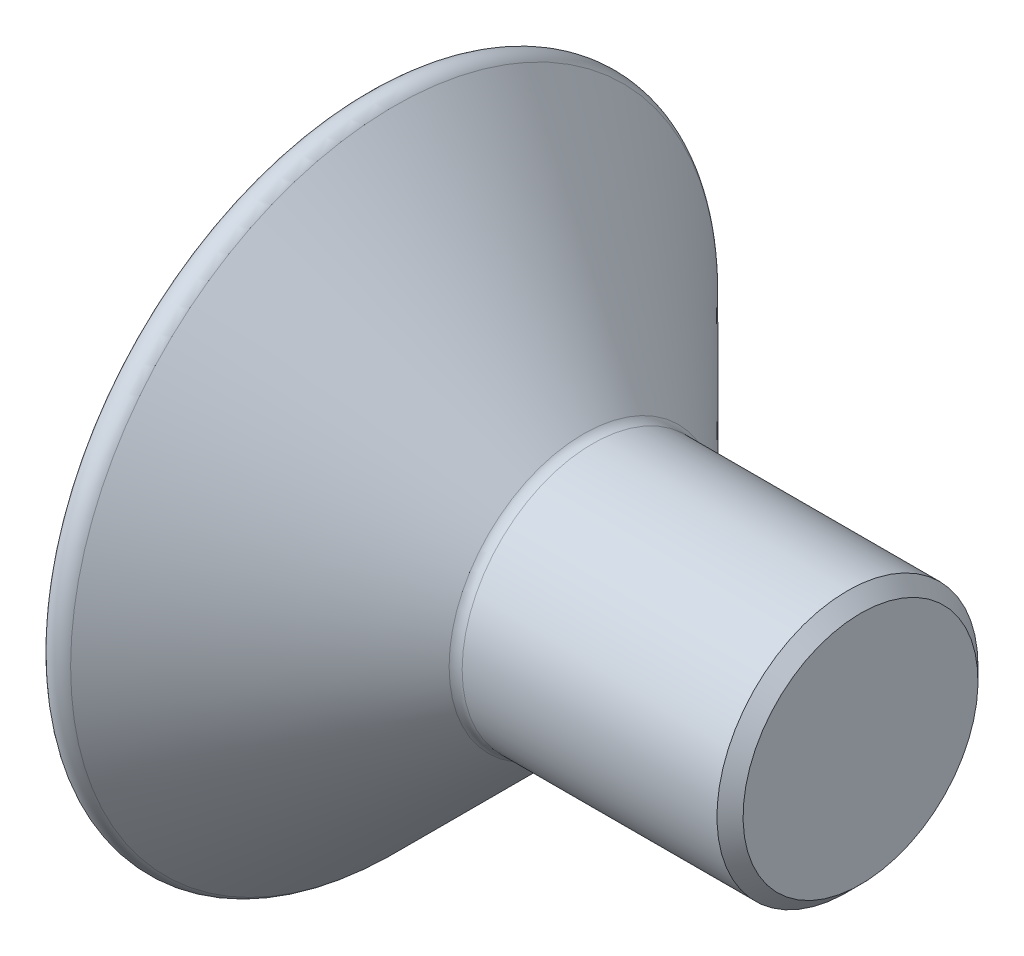
ISO-10303-21;
HEADER;
FILE_DESCRIPTION(('STEP AP214'),'2;1');
FILE_NAME('part.step','',(''),(''),'','','');
FILE_SCHEMA(('AUTOMOTIVE_DESIGN { 1 0 10303 214 1 1 1 1 }'));
ENDSEC;
DATA;
#1=APPLICATION_CONTEXT('core data for automotive mechanical design processes');
#2=APPLICATION_PROTOCOL_DEFINITION('international standard','automotive_design',2000,#1);
#3=PRODUCT_CONTEXT('',#1,'mechanical');
#4=PRODUCT('Part','Part','',(#3));
#5=PRODUCT_RELATED_PRODUCT_CATEGORY('part','',(#4));
#6=PRODUCT_DEFINITION_FORMATION('','',#4);
#7=PRODUCT_DEFINITION_CONTEXT('part definition',#1,'design');
#8=PRODUCT_DEFINITION('design','',#6,#7);
#9=PRODUCT_DEFINITION_SHAPE('','',#8);
#10=(LENGTH_UNIT() NAMED_UNIT(*) SI_UNIT(.MILLI.,.METRE.));
#11=(NAMED_UNIT(*) PLANE_ANGLE_UNIT() SI_UNIT($,.RADIAN.));
#12=(NAMED_UNIT(*) SI_UNIT($,.STERADIAN.) SOLID_ANGLE_UNIT());
#13=UNCERTAINTY_MEASURE_WITH_UNIT(LENGTH_MEASURE(1.E-05),#10,'distance_accuracy_value','');
#14=(GEOMETRIC_REPRESENTATION_CONTEXT(3) GLOBAL_UNCERTAINTY_ASSIGNED_CONTEXT((#13)) GLOBAL_UNIT_ASSIGNED_CONTEXT((#10,
#11,#12)) REPRESENTATION_CONTEXT('',''));
#15=CARTESIAN_POINT('',(0.,0.,0.));
#16=DIRECTION('',(0.,0.,1.));
#17=DIRECTION('',(1.,0.,0.));
#18=AXIS2_PLACEMENT_3D('',#15,#16,#17);
#19=CARTESIAN_POINT('',(-0.587069180985524,0.,0.));
#20=DIRECTION('',(-1.,0.,0.));
#21=DIRECTION('',(0.,0.,1.));
#22=AXIS2_PLACEMENT_3D('',#19,#20,#21);
#23=CYLINDRICAL_SURFACE('',#22,1.5);
#24=CARTESIAN_POINT('',(5.34999999999997,0.,0.));
#25=DIRECTION('',(1.,0.,0.));
#26=DIRECTION('',(0.,0.,-1.));
#27=AXIS2_PLACEMENT_3D('',#24,#25,#26);
#28=CIRCLE('',#27,1.5);
#29=CARTESIAN_POINT('',(5.34999999999997,0.,-1.5));
#30=VERTEX_POINT('',#29);
#31=EDGE_CURVE('E11',#30,#30,#28,.F.);
#32=ORIENTED_EDGE('',*,*,#31,.T.);
#33=EDGE_LOOP('',(#32));
#34=FACE_BOUND('',#33,.T.);
#35=CARTESIAN_POINT('',(2.42213203435594,0.,0.));
#36=DIRECTION('',(1.,0.,0.));
#37=DIRECTION('',(0.,0.,-1.));
#38=AXIS2_PLACEMENT_3D('',#35,#36,#37);
#39=CIRCLE('',#38,1.5);
#40=CARTESIAN_POINT('',(2.42213203435594,0.,-1.5));
#41=VERTEX_POINT('',#40);
#42=EDGE_CURVE('E192',#41,#41,#39,.T.);
#43=ORIENTED_EDGE('',*,*,#42,.T.);
#44=EDGE_LOOP('',(#43));
#45=FACE_BOUND('',#44,.T.);
#46=ADVANCED_FACE('F41',(#34,#45),#23,.T.);
#47=CARTESIAN_POINT('',(0.5,0.,0.));
#48=DIRECTION('',(-1.,0.,0.));
#49=DIRECTION('',(0.,0.,1.));
#50=AXIS2_PLACEMENT_3D('',#47,#48,#49);
#51=CONICAL_SURFACE('',#50,3.36,0.785398163397454);
#52=CARTESIAN_POINT('',(2.31606601717796,0.,0.));
#53=DIRECTION('',(1.,0.,0.));
#54=DIRECTION('',(0.,0.,-1.));
#55=AXIS2_PLACEMENT_3D('',#52,#53,#54);
#56=CIRCLE('',#55,1.54393398282202);
#57=CARTESIAN_POINT('',(2.31606601717796,0.,-1.54393398282202));
#58=VERTEX_POINT('',#57);
#59=EDGE_CURVE('E195',#58,#58,#56,.F.);
#60=ORIENTED_EDGE('',*,*,#59,.T.);
#61=EDGE_LOOP('',(#60));
#62=FACE_BOUND('',#61,.T.);
#63=CARTESIAN_POINT('',(0.141421356237312,0.,0.));
#64=DIRECTION('',(-1.,0.,0.));
#65=DIRECTION('',(0.,0.,1.));
#66=AXIS2_PLACEMENT_3D('',#63,#64,#65);
#67=CIRCLE('',#66,3.71857864376269);
#68=CARTESIAN_POINT('',(0.141421356237312,0.,3.71857864376269));
#69=VERTEX_POINT('',#68);
#70=EDGE_CURVE('E186',#69,#69,#67,.F.);
#71=ORIENTED_EDGE('',*,*,#70,.T.);
#72=EDGE_LOOP('',(#71));
#73=FACE_BOUND('',#72,.T.);
#74=ADVANCED_FACE('F211',(#62,#73),#51,.T.);
#75=CARTESIAN_POINT('',(-0.150000000000001,0.,0.));
#76=DIRECTION('',(1.,0.,0.));
#77=DIRECTION('',(0.,0.,-1.));
#78=AXIS2_PLACEMENT_3D('',#75,#76,#77);
#79=CONICAL_SURFACE('',#78,3.71,0.785398163397451);
#80=CARTESIAN_POINT('',(-0.141421356237308,0.,0.));
#81=DIRECTION('',(1.,0.,0.));
#82=DIRECTION('',(0.,0.,-1.));
#83=AXIS2_PLACEMENT_3D('',#80,#81,#82);
#84=CIRCLE('',#83,3.71857864376269);
#85=CARTESIAN_POINT('',(-0.141421356237308,0.,-3.71857864376269));
#86=VERTEX_POINT('',#85);
#87=EDGE_CURVE('E189',#86,#86,#84,.F.);
#88=ORIENTED_EDGE('',*,*,#87,.T.);
#89=EDGE_LOOP('',(#88));
#90=FACE_BOUND('',#89,.T.);
#91=CARTESIAN_POINT('',(-0.150000000000001,0.,0.));
#92=DIRECTION('',(1.,0.,0.));
#93=DIRECTION('',(0.,0.,-1.));
#94=AXIS2_PLACEMENT_3D('',#91,#92,#93);
#95=CIRCLE('',#94,3.71);
#96=CARTESIAN_POINT('',(-0.150000000000001,0.,-3.71));
#97=VERTEX_POINT('',#96);
#98=EDGE_CURVE('E142',#97,#97,#95,.T.);
#99=ORIENTED_EDGE('',*,*,#98,.T.);
#100=EDGE_LOOP('',(#99));
#101=FACE_BOUND('',#100,.T.);
#102=ADVANCED_FACE('F217',(#90,#101),#79,.T.);
#103=CARTESIAN_POINT('',(1.67735026918963,0.,0.));
#104=DIRECTION('',(-1.,0.,0.));
#105=DIRECTION('',(0.,0.,1.));
#106=AXIS2_PLACEMENT_3D('',#103,#104,#105);
#107=CONICAL_SURFACE('',#106,0.,1.0471975511966);
#108=CARTESIAN_POINT('',(1.1,0.,0.));
#109=DIRECTION('',(-1.,0.,0.));
#110=DIRECTION('',(0.,0.,1.));
#111=AXIS2_PLACEMENT_3D('',#108,#109,#110);
#112=CIRCLE('',#111,1.);
#113=CARTESIAN_POINT('',(1.1,0.5,0.866025403784438));
#114=VERTEX_POINT('',#113);
#115=CARTESIAN_POINT('',(1.1,1.,0.));
#116=VERTEX_POINT('',#115);
#117=EDGE_CURVE('E154',#114,#116,#112,.T.);
#118=ORIENTED_EDGE('',*,*,#117,.T.);
#119=CARTESIAN_POINT('',(1.1,0.5,-0.866025403784439));
#120=VERTEX_POINT('',#119);
#121=EDGE_CURVE('E157',#116,#120,#112,.T.);
#122=ORIENTED_EDGE('',*,*,#121,.T.);
#123=CARTESIAN_POINT('',(1.1,-0.5,-0.866025403784439));
#124=VERTEX_POINT('',#123);
#125=EDGE_CURVE('E300',#120,#124,#112,.T.);
#126=ORIENTED_EDGE('',*,*,#125,.T.);
#127=CARTESIAN_POINT('',(1.1,-1.,0.));
#128=VERTEX_POINT('',#127);
#129=EDGE_CURVE('E291',#124,#128,#112,.T.);
#130=ORIENTED_EDGE('',*,*,#129,.T.);
#131=CARTESIAN_POINT('',(1.1,-0.5,0.866025403784438));
#132=VERTEX_POINT('',#131);
#133=EDGE_CURVE('E56',#128,#132,#112,.T.);
#134=ORIENTED_EDGE('',*,*,#133,.T.);
#135=EDGE_CURVE('E158',#132,#114,#112,.T.);
#136=ORIENTED_EDGE('',*,*,#135,.T.);
#137=EDGE_LOOP('',(#118,#122,#126,#130,#134,#136));
#138=FACE_BOUND('',#137,.T.);
#139=CARTESIAN_POINT('',(1.67735026918963,0.,0.));
#140=VERTEX_POINT('',#139);
#141=VERTEX_LOOP('',#140);
#142=FACE_BOUND('',#141,.T.);
#143=ADVANCED_FACE('F240',(#138,#142),#107,.F.);
#144=CARTESIAN_POINT('',(1.1,0.,-1.15470053837925));
#145=DIRECTION('',(1.,0.,0.));
#146=DIRECTION('',(0.,0.,-1.));
#147=AXIS2_PLACEMENT_3D('',#144,#145,#146);
#148=PLANE('',#147);
#149=ORIENTED_EDGE('',*,*,#135,.F.);
#150=DIRECTION('',(0.,-0.866025403784438,-0.5));
#151=VECTOR('',#150,1.);
#152=CARTESIAN_POINT('',(1.1,0.,1.15470053837925));
#153=LINE('',#152,#151);
#154=CARTESIAN_POINT('',(1.1,0.,1.15470053837925));
#155=VERTEX_POINT('',#154);
#156=EDGE_CURVE('E174',#155,#132,#153,.T.);
#157=ORIENTED_EDGE('',*,*,#156,.F.);
#158=DIRECTION('',(0.,-0.866025403784439,0.5));
#159=VECTOR('',#158,1.);
#160=CARTESIAN_POINT('',(1.1,1.,0.577350269189625));
#161=LINE('',#160,#159);
#162=EDGE_CURVE('E169',#114,#155,#161,.T.);
#163=ORIENTED_EDGE('',*,*,#162,.F.);
#164=EDGE_LOOP('',(#149,#157,#163));
#165=FACE_BOUND('',#164,.T.);
#166=ADVANCED_FACE('F246',(#165),#148,.F.);
#167=ORIENTED_EDGE('',*,*,#117,.F.);
#168=CARTESIAN_POINT('',(1.1,1.,0.577350269189625));
#169=VERTEX_POINT('',#168);
#170=EDGE_CURVE('E170',#169,#114,#161,.T.);
#171=ORIENTED_EDGE('',*,*,#170,.F.);
#172=DIRECTION('',(0.,0.,1.));
#173=VECTOR('',#172,1.);
#174=CARTESIAN_POINT('',(1.1,1.,-0.577350269189626));
#175=LINE('',#174,#173);
#176=EDGE_CURVE('E165',#116,#169,#175,.T.);
#177=ORIENTED_EDGE('',*,*,#176,.F.);
#178=EDGE_LOOP('',(#167,#171,#177));
#179=FACE_BOUND('',#178,.T.);
#180=ADVANCED_FACE('F249',(#179),#148,.F.);
#181=ORIENTED_EDGE('',*,*,#121,.F.);
#182=CARTESIAN_POINT('',(1.1,1.,-0.577350269189626));
#183=VERTEX_POINT('',#182);
#184=EDGE_CURVE('E166',#183,#116,#175,.T.);
#185=ORIENTED_EDGE('',*,*,#184,.F.);
#186=DIRECTION('',(0.,0.866025403784438,0.5));
#187=VECTOR('',#186,1.);
#188=CARTESIAN_POINT('',(1.1,0.,-1.15470053837925));
#189=LINE('',#188,#187);
#190=EDGE_CURVE('E161',#120,#183,#189,.T.);
#191=ORIENTED_EDGE('',*,*,#190,.F.);
#192=EDGE_LOOP('',(#181,#185,#191));
#193=FACE_BOUND('',#192,.T.);
#194=ADVANCED_FACE('F252',(#193),#148,.F.);
#195=ORIENTED_EDGE('',*,*,#125,.F.);
#196=CARTESIAN_POINT('',(1.1,0.,-1.15470053837925));
#197=VERTEX_POINT('',#196);
#198=EDGE_CURVE('E162',#197,#120,#189,.T.);
#199=ORIENTED_EDGE('',*,*,#198,.F.);
#200=DIRECTION('',(0.,0.866025403784439,-0.5));
#201=VECTOR('',#200,1.);
#202=CARTESIAN_POINT('',(1.1,-1.,-0.577350269189627));
#203=LINE('',#202,#201);
#204=EDGE_CURVE('E156',#124,#197,#203,.T.);
#205=ORIENTED_EDGE('',*,*,#204,.F.);
#206=EDGE_LOOP('',(#195,#199,#205));
#207=FACE_BOUND('',#206,.T.);
#208=ADVANCED_FACE('F299',(#207),#148,.F.);
#209=ORIENTED_EDGE('',*,*,#129,.F.);
#210=CARTESIAN_POINT('',(1.1,-1.,-0.577350269189627));
#211=VERTEX_POINT('',#210);
#212=EDGE_CURVE('E159',#211,#124,#203,.T.);
#213=ORIENTED_EDGE('',*,*,#212,.F.);
#214=DIRECTION('',(0.,0.,-1.));
#215=VECTOR('',#214,1.);
#216=CARTESIAN_POINT('',(1.1,-1.,0.577350269189625));
#217=LINE('',#216,#215);
#218=EDGE_CURVE('E64',#128,#211,#217,.T.);
#219=ORIENTED_EDGE('',*,*,#218,.F.);
#220=EDGE_LOOP('',(#209,#213,#219));
#221=FACE_BOUND('',#220,.T.);
#222=ADVANCED_FACE('F294',(#221),#148,.F.);
#223=ORIENTED_EDGE('',*,*,#133,.F.);
#224=CARTESIAN_POINT('',(1.1,-1.,0.577350269189625));
#225=VERTEX_POINT('',#224);
#226=EDGE_CURVE('E124',#225,#128,#217,.T.);
#227=ORIENTED_EDGE('',*,*,#226,.F.);
#228=EDGE_CURVE('E173',#132,#225,#153,.T.);
#229=ORIENTED_EDGE('',*,*,#228,.F.);
#230=EDGE_LOOP('',(#223,#227,#229));
#231=FACE_BOUND('',#230,.T.);
#232=ADVANCED_FACE('F260',(#231),#148,.F.);
#233=CARTESIAN_POINT('',(1.1,0.,1.15470053837925));
#234=DIRECTION('',(0.,0.5,-0.866025403784438));
#235=DIRECTION('',(0.,0.866025403784438,0.5));
#236=AXIS2_PLACEMENT_3D('',#233,#234,#235);
#237=PLANE('',#236);
#238=DIRECTION('',(-1.,0.,0.));
#239=VECTOR('',#238,1.);
#240=CARTESIAN_POINT('',(1.1,-1.,0.577350269189625));
#241=LINE('',#240,#239);
#242=CARTESIAN_POINT('',(-0.15,-1.,0.577350269189625));
#243=VERTEX_POINT('',#242);
#244=EDGE_CURVE('E123',#225,#243,#241,.T.);
#245=ORIENTED_EDGE('',*,*,#244,.T.);
#246=DIRECTION('',(0.,-0.866025403784438,-0.5));
#247=VECTOR('',#246,1.);
#248=CARTESIAN_POINT('',(-0.15,-0.5,0.866025403784438));
#249=LINE('',#248,#247);
#250=CARTESIAN_POINT('',(-0.15,0.,1.15470053837925));
#251=VERTEX_POINT('',#250);
#252=EDGE_CURVE('E141',#251,#243,#249,.T.);
#253=ORIENTED_EDGE('',*,*,#252,.F.);
#254=DIRECTION('',(-1.,0.,0.));
#255=VECTOR('',#254,1.);
#256=CARTESIAN_POINT('',(1.1,0.,1.15470053837925));
#257=LINE('',#256,#255);
#258=EDGE_CURVE('E179',#155,#251,#257,.T.);
#259=ORIENTED_EDGE('',*,*,#258,.F.);
#260=ORIENTED_EDGE('',*,*,#156,.T.);
#261=ORIENTED_EDGE('',*,*,#228,.T.);
#262=EDGE_LOOP('',(#245,#253,#259,#260,#261));
#263=FACE_BOUND('',#262,.T.);
#264=ADVANCED_FACE('F256',(#263),#237,.T.);
#265=CARTESIAN_POINT('',(1.1,1.,0.577350269189625));
#266=DIRECTION('',(0.,-0.5,-0.866025403784438));
#267=DIRECTION('',(0.,0.866025403784439,-0.5));
#268=AXIS2_PLACEMENT_3D('',#265,#266,#267);
#269=PLANE('',#268);
#270=ORIENTED_EDGE('',*,*,#258,.T.);
#271=DIRECTION('',(0.,-0.866025403784439,0.5));
#272=VECTOR('',#271,1.);
#273=CARTESIAN_POINT('',(-0.15,0.5,0.866025403784438));
#274=LINE('',#273,#272);
#275=CARTESIAN_POINT('',(-0.15,1.,0.577350269189625));
#276=VERTEX_POINT('',#275);
#277=EDGE_CURVE('E151',#276,#251,#274,.T.);
#278=ORIENTED_EDGE('',*,*,#277,.F.);
#279=DIRECTION('',(-1.,0.,0.));
#280=VECTOR('',#279,1.);
#281=CARTESIAN_POINT('',(1.1,1.,0.577350269189625));
#282=LINE('',#281,#280);
#283=EDGE_CURVE('E181',#169,#276,#282,.T.);
#284=ORIENTED_EDGE('',*,*,#283,.F.);
#285=ORIENTED_EDGE('',*,*,#170,.T.);
#286=ORIENTED_EDGE('',*,*,#162,.T.);
#287=EDGE_LOOP('',(#270,#278,#284,#285,#286));
#288=FACE_BOUND('',#287,.T.);
#289=ADVANCED_FACE('F259',(#288),#269,.T.);
#290=CARTESIAN_POINT('',(1.1,1.,-0.577350269189626));
#291=DIRECTION('',(0.,-1.,0.));
#292=DIRECTION('',(0.,0.,-1.));
#293=AXIS2_PLACEMENT_3D('',#290,#291,#292);
#294=PLANE('',#293);
#295=ORIENTED_EDGE('',*,*,#283,.T.);
#296=DIRECTION('',(0.,0.,1.));
#297=VECTOR('',#296,1.);
#298=CARTESIAN_POINT('',(-0.15,1.,0.));
#299=LINE('',#298,#297);
#300=CARTESIAN_POINT('',(-0.15,1.,-0.577350269189626));
#301=VERTEX_POINT('',#300);
#302=EDGE_CURVE('E148',#301,#276,#299,.T.);
#303=ORIENTED_EDGE('',*,*,#302,.F.);
#304=DIRECTION('',(-1.,0.,0.));
#305=VECTOR('',#304,1.);
#306=CARTESIAN_POINT('',(1.1,1.,-0.577350269189626));
#307=LINE('',#306,#305);
#308=EDGE_CURVE('E183',#183,#301,#307,.T.);
#309=ORIENTED_EDGE('',*,*,#308,.F.);
#310=ORIENTED_EDGE('',*,*,#184,.T.);
#311=ORIENTED_EDGE('',*,*,#176,.T.);
#312=EDGE_LOOP('',(#295,#303,#309,#310,#311));
#313=FACE_BOUND('',#312,.T.);
#314=ADVANCED_FACE('F264',(#313),#294,.T.);
#315=CARTESIAN_POINT('',(1.1,0.,-1.15470053837925));
#316=DIRECTION('',(0.,-0.5,0.866025403784439));
#317=DIRECTION('',(0.,-0.866025403784439,-0.5));
#318=AXIS2_PLACEMENT_3D('',#315,#316,#317);
#319=PLANE('',#318);
#320=ORIENTED_EDGE('',*,*,#308,.T.);
#321=DIRECTION('',(0.,0.866025403784438,0.5));
#322=VECTOR('',#321,1.);
#323=CARTESIAN_POINT('',(-0.15,0.5,-0.866025403784438));
#324=LINE('',#323,#322);
#325=CARTESIAN_POINT('',(-0.15,0.,-1.15470053837925));
#326=VERTEX_POINT('',#325);
#327=EDGE_CURVE('E134',#326,#301,#324,.T.);
#328=ORIENTED_EDGE('',*,*,#327,.F.);
#329=DIRECTION('',(-1.,0.,0.));
#330=VECTOR('',#329,1.);
#331=CARTESIAN_POINT('',(1.1,0.,-1.15470053837925));
#332=LINE('',#331,#330);
#333=EDGE_CURVE('E130',#197,#326,#332,.T.);
#334=ORIENTED_EDGE('',*,*,#333,.F.);
#335=ORIENTED_EDGE('',*,*,#198,.T.);
#336=ORIENTED_EDGE('',*,*,#190,.T.);
#337=EDGE_LOOP('',(#320,#328,#334,#335,#336));
#338=FACE_BOUND('',#337,.T.);
#339=ADVANCED_FACE('F267',(#338),#319,.T.);
#340=CARTESIAN_POINT('',(1.1,-1.,-0.577350269189627));
#341=DIRECTION('',(0.,0.5,0.866025403784439));
#342=DIRECTION('',(0.,-0.866025403784439,0.5));
#343=AXIS2_PLACEMENT_3D('',#340,#341,#342);
#344=PLANE('',#343);
#345=ORIENTED_EDGE('',*,*,#333,.T.);
#346=DIRECTION('',(0.,0.866025403784439,-0.5));
#347=VECTOR('',#346,1.);
#348=CARTESIAN_POINT('',(-0.15,-0.500000000000001,-0.866025403784439));
#349=LINE('',#348,#347);
#350=CARTESIAN_POINT('',(-0.15,-1.,-0.577350269189627));
#351=VERTEX_POINT('',#350);
#352=EDGE_CURVE('E127',#351,#326,#349,.T.);
#353=ORIENTED_EDGE('',*,*,#352,.F.);
#354=DIRECTION('',(-1.,0.,0.));
#355=VECTOR('',#354,1.);
#356=CARTESIAN_POINT('',(1.1,-1.,-0.577350269189627));
#357=LINE('',#356,#355);
#358=EDGE_CURVE('E114',#211,#351,#357,.T.);
#359=ORIENTED_EDGE('',*,*,#358,.F.);
#360=ORIENTED_EDGE('',*,*,#212,.T.);
#361=ORIENTED_EDGE('',*,*,#204,.T.);
#362=EDGE_LOOP('',(#345,#353,#359,#360,#361));
#363=FACE_BOUND('',#362,.T.);
#364=ADVANCED_FACE('F128',(#363),#344,.T.);
#365=CARTESIAN_POINT('',(1.1,-1.,0.577350269189625));
#366=DIRECTION('',(0.,1.,0.));
#367=DIRECTION('',(0.,0.,1.));
#368=AXIS2_PLACEMENT_3D('',#365,#366,#367);
#369=PLANE('',#368);
#370=ORIENTED_EDGE('',*,*,#358,.T.);
#371=DIRECTION('',(0.,0.,-1.));
#372=VECTOR('',#371,1.);
#373=CARTESIAN_POINT('',(-0.15,-1.,0.));
#374=LINE('',#373,#372);
#375=EDGE_CURVE('E119',#243,#351,#374,.T.);
#376=ORIENTED_EDGE('',*,*,#375,.F.);
#377=ORIENTED_EDGE('',*,*,#244,.F.);
#378=ORIENTED_EDGE('',*,*,#226,.T.);
#379=ORIENTED_EDGE('',*,*,#218,.T.);
#380=EDGE_LOOP('',(#370,#376,#377,#378,#379));
#381=FACE_BOUND('',#380,.T.);
#382=ADVANCED_FACE('F116',(#381),#369,.T.);
#383=CARTESIAN_POINT('',(-0.15,0.,0.));
#384=DIRECTION('',(-1.,0.,0.));
#385=DIRECTION('',(0.,0.,1.));
#386=AXIS2_PLACEMENT_3D('',#383,#384,#385);
#387=PLANE('',#386);
#388=ORIENTED_EDGE('',*,*,#375,.T.);
#389=ORIENTED_EDGE('',*,*,#352,.T.);
#390=ORIENTED_EDGE('',*,*,#327,.T.);
#391=ORIENTED_EDGE('',*,*,#302,.T.);
#392=ORIENTED_EDGE('',*,*,#277,.T.);
#393=ORIENTED_EDGE('',*,*,#252,.T.);
#394=EDGE_LOOP('',(#388,#389,#390,#391,#392,#393));
#395=FACE_BOUND('',#394,.T.);
#396=ORIENTED_EDGE('',*,*,#98,.F.);
#397=EDGE_LOOP('',(#396));
#398=FACE_BOUND('',#397,.T.);
#399=ADVANCED_FACE('F137',(#395,#398),#387,.T.);
#400=CARTESIAN_POINT('',(0.,0.,0.));
#401=DIRECTION('',(-1.,0.,0.));
#402=DIRECTION('',(0.,0.,1.));
#403=AXIS2_PLACEMENT_3D('',#400,#401,#402);
#404=TOROIDAL_SURFACE('',#403,3.57715728752538,0.2);
#405=ORIENTED_EDGE('',*,*,#87,.F.);
#406=EDGE_LOOP('',(#405));
#407=FACE_BOUND('',#406,.T.);
#408=ORIENTED_EDGE('',*,*,#70,.F.);
#409=EDGE_LOOP('',(#408));
#410=FACE_BOUND('',#409,.T.);
#411=ADVANCED_FACE('F224',(#407,#410),#404,.T.);
#412=CARTESIAN_POINT('',(5.49999999999998,0.,0.));
#413=DIRECTION('',(1.,0.,0.));
#414=DIRECTION('',(0.,1.,0.));
#415=AXIS2_PLACEMENT_3D('',#412,#413,#414);
#416=PLANE('',#415);
#417=CARTESIAN_POINT('',(5.49999999999998,0.,0.));
#418=DIRECTION('',(1.,0.,0.));
#419=DIRECTION('',(0.,1.,0.));
#420=AXIS2_PLACEMENT_3D('',#417,#418,#419);
#421=CIRCLE('',#420,1.35);
#422=CARTESIAN_POINT('',(5.49999999999998,1.35,0.));
#423=VERTEX_POINT('',#422);
#424=EDGE_CURVE('E49',#423,#423,#421,.T.);
#425=ORIENTED_EDGE('',*,*,#424,.T.);
#426=EDGE_LOOP('',(#425));
#427=FACE_BOUND('',#426,.T.);
#428=ADVANCED_FACE('F200',(#427),#416,.T.);
#429=CARTESIAN_POINT('',(2.42213203435594,0.,0.));
#430=DIRECTION('',(1.,0.,0.));
#431=DIRECTION('',(0.,0.,-1.));
#432=AXIS2_PLACEMENT_3D('',#429,#430,#431);
#433=TOROIDAL_SURFACE('',#432,1.65,0.15);
#434=ORIENTED_EDGE('',*,*,#59,.F.);
#435=EDGE_LOOP('',(#434));
#436=FACE_BOUND('',#435,.T.);
#437=ORIENTED_EDGE('',*,*,#42,.F.);
#438=EDGE_LOOP('',(#437));
#439=FACE_BOUND('',#438,.T.);
#440=ADVANCED_FACE('F203',(#436,#439),#433,.F.);
#441=CARTESIAN_POINT('',(5.49999999999998,0.,0.));
#442=DIRECTION('',(-1.,0.,0.));
#443=DIRECTION('',(0.,0.,1.));
#444=AXIS2_PLACEMENT_3D('',#441,#442,#443);
#445=CONICAL_SURFACE('',#444,1.35,0.785398163397443);
#446=ORIENTED_EDGE('',*,*,#31,.F.);
#447=EDGE_LOOP('',(#446));
#448=FACE_BOUND('',#447,.T.);
#449=ORIENTED_EDGE('',*,*,#424,.F.);
#450=EDGE_LOOP('',(#449));
#451=FACE_BOUND('',#450,.T.);
#452=ADVANCED_FACE('F43',(#448,#451),#445,.T.);
#453=CLOSED_SHELL('',(#46,#74,#102,#143,#166,#180,#194,#208,#222,#232,#264,#289,#314,#339,#364,
#382,#399,#411,#428,#440,#452));
#454=MANIFOLD_SOLID_BREP('B2',#453);
#455=ADVANCED_BREP_SHAPE_REPRESENTATION('',(#18,#454),#14);
#456=SHAPE_DEFINITION_REPRESENTATION(#9,#455);
ENDSEC;
END-ISO-10303-21;
